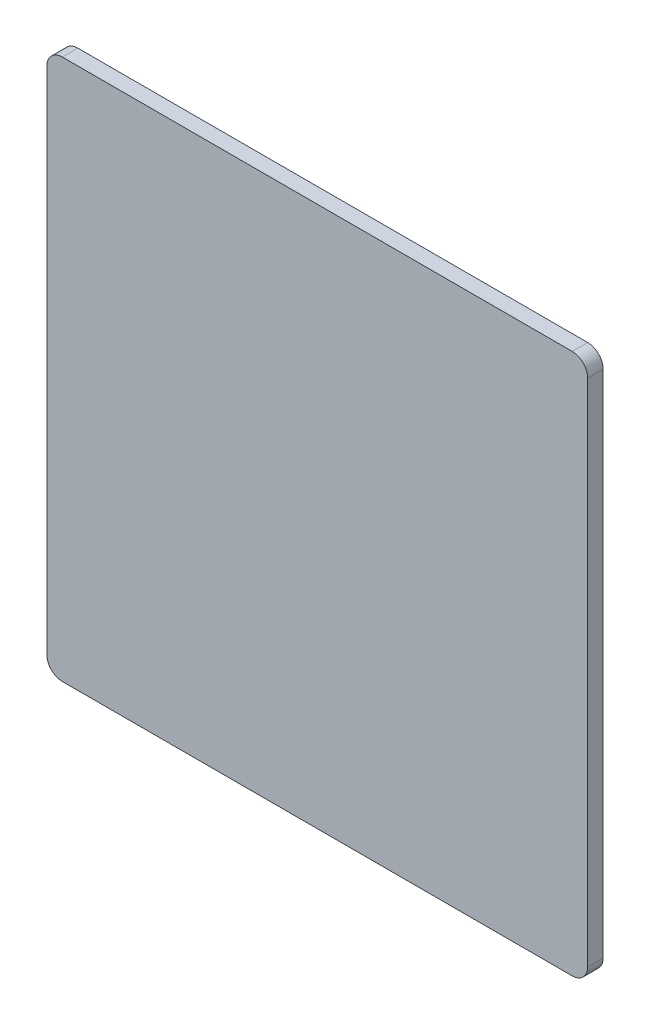
ISO-10303-21;
HEADER;
FILE_DESCRIPTION(('STEP AP214'),'2;1');
FILE_NAME('part.step','',(''),(''),'','','');
FILE_SCHEMA(('AUTOMOTIVE_DESIGN { 1 0 10303 214 1 1 1 1 }'));
ENDSEC;
DATA;
#1=APPLICATION_CONTEXT('core data for automotive mechanical design processes');
#2=APPLICATION_PROTOCOL_DEFINITION('international standard','automotive_design',2000,#1);
#3=PRODUCT_CONTEXT('',#1,'mechanical');
#4=PRODUCT('Part','Part','',(#3));
#5=PRODUCT_RELATED_PRODUCT_CATEGORY('part','',(#4));
#6=PRODUCT_DEFINITION_FORMATION('','',#4);
#7=PRODUCT_DEFINITION_CONTEXT('part definition',#1,'design');
#8=PRODUCT_DEFINITION('design','',#6,#7);
#9=PRODUCT_DEFINITION_SHAPE('','',#8);
#10=(LENGTH_UNIT() NAMED_UNIT(*) SI_UNIT(.MILLI.,.METRE.));
#11=(NAMED_UNIT(*) PLANE_ANGLE_UNIT() SI_UNIT($,.RADIAN.));
#12=(NAMED_UNIT(*) SI_UNIT($,.STERADIAN.) SOLID_ANGLE_UNIT());
#13=UNCERTAINTY_MEASURE_WITH_UNIT(LENGTH_MEASURE(1.E-05),#10,'distance_accuracy_value','');
#14=(GEOMETRIC_REPRESENTATION_CONTEXT(3) GLOBAL_UNCERTAINTY_ASSIGNED_CONTEXT((#13)) GLOBAL_UNIT_ASSIGNED_CONTEXT((#10,
#11,#12)) REPRESENTATION_CONTEXT('',''));
#15=CARTESIAN_POINT('',(0.,0.,0.));
#16=DIRECTION('',(0.,0.,1.));
#17=DIRECTION('',(1.,0.,0.));
#18=AXIS2_PLACEMENT_3D('',#15,#16,#17);
#19=CARTESIAN_POINT('',(35.,-35.,2.));
#20=DIRECTION('',(-1.,0.,0.));
#21=DIRECTION('',(0.,0.,1.));
#22=AXIS2_PLACEMENT_3D('',#19,#20,#21);
#23=PLANE('',#22);
#24=DIRECTION('',(0.,1.,0.));
#25=VECTOR('',#24,1.);
#26=CARTESIAN_POINT('',(35.,-35.,2.));
#27=LINE('',#26,#25);
#28=CARTESIAN_POINT('',(35.,-33.,2.));
#29=VERTEX_POINT('',#28);
#30=CARTESIAN_POINT('',(35.,33.,2.));
#31=VERTEX_POINT('',#30);
#32=EDGE_CURVE('E199',#29,#31,#27,.T.);
#33=ORIENTED_EDGE('',*,*,#32,.F.);
#34=DIRECTION('',(0.,0.,-1.));
#35=VECTOR('',#34,1.);
#36=CARTESIAN_POINT('',(35.,-33.,2.));
#37=LINE('',#36,#35);
#38=CARTESIAN_POINT('',(35.,-33.,0.));
#39=VERTEX_POINT('',#38);
#40=EDGE_CURVE('E239',#29,#39,#37,.T.);
#41=ORIENTED_EDGE('',*,*,#40,.T.);
#42=DIRECTION('',(0.,1.,0.));
#43=VECTOR('',#42,1.);
#44=CARTESIAN_POINT('',(35.,-35.,0.));
#45=LINE('',#44,#43);
#46=CARTESIAN_POINT('',(35.,33.,0.));
#47=VERTEX_POINT('',#46);
#48=EDGE_CURVE('E196',#39,#47,#45,.T.);
#49=ORIENTED_EDGE('',*,*,#48,.T.);
#50=DIRECTION('',(0.,0.,-1.));
#51=VECTOR('',#50,1.);
#52=CARTESIAN_POINT('',(35.,33.,2.));
#53=LINE('',#52,#51);
#54=EDGE_CURVE('E226',#47,#31,#53,.F.);
#55=ORIENTED_EDGE('',*,*,#54,.T.);
#56=EDGE_LOOP('',(#33,#41,#49,#55));
#57=FACE_BOUND('',#56,.T.);
#58=ADVANCED_FACE('F33',(#57),#23,.F.);
#59=CARTESIAN_POINT('',(-35.,35.,2.));
#60=DIRECTION('',(0.,-1.,0.));
#61=DIRECTION('',(0.,0.,-1.));
#62=AXIS2_PLACEMENT_3D('',#59,#60,#61);
#63=PLANE('',#62);
#64=DIRECTION('',(-1.,0.,0.));
#65=VECTOR('',#64,1.);
#66=CARTESIAN_POINT('',(-35.,35.,0.));
#67=LINE('',#66,#65);
#68=CARTESIAN_POINT('',(33.,35.,0.));
#69=VERTEX_POINT('',#68);
#70=CARTESIAN_POINT('',(-33.,35.,0.));
#71=VERTEX_POINT('',#70);
#72=EDGE_CURVE('E213',#69,#71,#67,.T.);
#73=ORIENTED_EDGE('',*,*,#72,.T.);
#74=DIRECTION('',(0.,0.,-1.));
#75=VECTOR('',#74,1.);
#76=CARTESIAN_POINT('',(-33.,35.,2.));
#77=LINE('',#76,#75);
#78=CARTESIAN_POINT('',(-33.,35.,2.));
#79=VERTEX_POINT('',#78);
#80=EDGE_CURVE('E11',#71,#79,#77,.F.);
#81=ORIENTED_EDGE('',*,*,#80,.T.);
#82=DIRECTION('',(-1.,0.,0.));
#83=VECTOR('',#82,1.);
#84=CARTESIAN_POINT('',(-35.,35.,2.));
#85=LINE('',#84,#83);
#86=CARTESIAN_POINT('',(33.,35.,2.));
#87=VERTEX_POINT('',#86);
#88=EDGE_CURVE('E202',#87,#79,#85,.T.);
#89=ORIENTED_EDGE('',*,*,#88,.F.);
#90=DIRECTION('',(0.,0.,-1.));
#91=VECTOR('',#90,1.);
#92=CARTESIAN_POINT('',(33.,35.,2.));
#93=LINE('',#92,#91);
#94=EDGE_CURVE('E41',#87,#69,#93,.T.);
#95=ORIENTED_EDGE('',*,*,#94,.T.);
#96=EDGE_LOOP('',(#73,#81,#89,#95));
#97=FACE_BOUND('',#96,.T.);
#98=ADVANCED_FACE('F270',(#97),#63,.F.);
#99=CARTESIAN_POINT('',(-35.,-35.,2.));
#100=DIRECTION('',(1.,0.,0.));
#101=DIRECTION('',(0.,0.,-1.));
#102=AXIS2_PLACEMENT_3D('',#99,#100,#101);
#103=PLANE('',#102);
#104=DIRECTION('',(0.,-1.,0.));
#105=VECTOR('',#104,1.);
#106=CARTESIAN_POINT('',(-35.,-35.,0.));
#107=LINE('',#106,#105);
#108=CARTESIAN_POINT('',(-35.,33.,0.));
#109=VERTEX_POINT('',#108);
#110=CARTESIAN_POINT('',(-35.,-33.,0.));
#111=VERTEX_POINT('',#110);
#112=EDGE_CURVE('E216',#109,#111,#107,.T.);
#113=ORIENTED_EDGE('',*,*,#112,.T.);
#114=DIRECTION('',(0.,0.,-1.));
#115=VECTOR('',#114,1.);
#116=CARTESIAN_POINT('',(-35.,-33.,2.));
#117=LINE('',#116,#115);
#118=CARTESIAN_POINT('',(-35.,-33.,2.));
#119=VERTEX_POINT('',#118);
#120=EDGE_CURVE('E48',#111,#119,#117,.F.);
#121=ORIENTED_EDGE('',*,*,#120,.T.);
#122=DIRECTION('',(0.,-1.,0.));
#123=VECTOR('',#122,1.);
#124=CARTESIAN_POINT('',(-35.,-35.,2.));
#125=LINE('',#124,#123);
#126=CARTESIAN_POINT('',(-35.,33.,2.));
#127=VERTEX_POINT('',#126);
#128=EDGE_CURVE('E205',#127,#119,#125,.T.);
#129=ORIENTED_EDGE('',*,*,#128,.F.);
#130=DIRECTION('',(0.,0.,-1.));
#131=VECTOR('',#130,1.);
#132=CARTESIAN_POINT('',(-35.,33.,2.));
#133=LINE('',#132,#131);
#134=EDGE_CURVE('E262',#127,#109,#133,.T.);
#135=ORIENTED_EDGE('',*,*,#134,.T.);
#136=EDGE_LOOP('',(#113,#121,#129,#135));
#137=FACE_BOUND('',#136,.T.);
#138=ADVANCED_FACE('F281',(#137),#103,.F.);
#139=CARTESIAN_POINT('',(-35.,-35.,2.));
#140=DIRECTION('',(0.,1.,0.));
#141=DIRECTION('',(0.,0.,1.));
#142=AXIS2_PLACEMENT_3D('',#139,#140,#141);
#143=PLANE('',#142);
#144=DIRECTION('',(1.,0.,0.));
#145=VECTOR('',#144,1.);
#146=CARTESIAN_POINT('',(-35.,-35.,0.));
#147=LINE('',#146,#145);
#148=CARTESIAN_POINT('',(7.2,-35.,0.));
#149=VERTEX_POINT('',#148);
#150=CARTESIAN_POINT('',(33.,-35.,0.));
#151=VERTEX_POINT('',#150);
#152=EDGE_CURVE('E218',#149,#151,#147,.T.);
#153=ORIENTED_EDGE('',*,*,#152,.T.);
#154=DIRECTION('',(0.,0.,-1.));
#155=VECTOR('',#154,1.);
#156=CARTESIAN_POINT('',(33.,-35.,2.));
#157=LINE('',#156,#155);
#158=CARTESIAN_POINT('',(33.,-35.,2.));
#159=VERTEX_POINT('',#158);
#160=EDGE_CURVE('E253',#151,#159,#157,.F.);
#161=ORIENTED_EDGE('',*,*,#160,.T.);
#162=DIRECTION('',(1.,0.,0.));
#163=VECTOR('',#162,1.);
#164=CARTESIAN_POINT('',(-35.,-35.,2.));
#165=LINE('',#164,#163);
#166=CARTESIAN_POINT('',(-33.,-35.,2.));
#167=VERTEX_POINT('',#166);
#168=EDGE_CURVE('E207',#167,#159,#165,.T.);
#169=ORIENTED_EDGE('',*,*,#168,.F.);
#170=DIRECTION('',(0.,0.,-1.));
#171=VECTOR('',#170,1.);
#172=CARTESIAN_POINT('',(-33.,-35.,2.));
#173=LINE('',#172,#171);
#174=CARTESIAN_POINT('',(-33.,-35.,0.));
#175=VERTEX_POINT('',#174);
#176=EDGE_CURVE('E250',#167,#175,#173,.T.);
#177=ORIENTED_EDGE('',*,*,#176,.T.);
#178=CARTESIAN_POINT('',(-7.2,-35.,0.));
#179=VERTEX_POINT('',#178);
#180=EDGE_CURVE('E203',#175,#179,#147,.T.);
#181=ORIENTED_EDGE('',*,*,#180,.T.);
#182=DIRECTION('',(0.,0.,-1.));
#183=VECTOR('',#182,1.);
#184=CARTESIAN_POINT('',(-7.2,-35.,1.9));
#185=LINE('',#184,#183);
#186=CARTESIAN_POINT('',(-7.2,-35.,-6.5));
#187=VERTEX_POINT('',#186);
#188=EDGE_CURVE('E189',#179,#187,#185,.T.);
#189=ORIENTED_EDGE('',*,*,#188,.T.);
#190=DIRECTION('',(1.,0.,0.));
#191=VECTOR('',#190,1.);
#192=CARTESIAN_POINT('',(7.2,-35.,-6.5));
#193=LINE('',#192,#191);
#194=CARTESIAN_POINT('',(7.2,-35.,-6.5));
#195=VERTEX_POINT('',#194);
#196=EDGE_CURVE('E181',#187,#195,#193,.T.);
#197=ORIENTED_EDGE('',*,*,#196,.T.);
#198=DIRECTION('',(0.,0.,1.));
#199=VECTOR('',#198,1.);
#200=CARTESIAN_POINT('',(7.2,-35.,1.9));
#201=LINE('',#200,#199);
#202=EDGE_CURVE('E187',#195,#149,#201,.T.);
#203=ORIENTED_EDGE('',*,*,#202,.T.);
#204=EDGE_LOOP('',(#153,#161,#169,#177,#181,#189,#197,#203));
#205=FACE_BOUND('',#204,.T.);
#206=DIRECTION('',(1.,0.,0.));
#207=VECTOR('',#206,1.);
#208=CARTESIAN_POINT('',(5.2,-35.,-4.5));
#209=LINE('',#208,#207);
#210=CARTESIAN_POINT('',(-5.2,-35.,-4.5));
#211=VERTEX_POINT('',#210);
#212=CARTESIAN_POINT('',(5.2,-35.,-4.5));
#213=VERTEX_POINT('',#212);
#214=EDGE_CURVE('E163',#211,#213,#209,.T.);
#215=ORIENTED_EDGE('',*,*,#214,.F.);
#216=DIRECTION('',(0.,0.,-1.));
#217=VECTOR('',#216,1.);
#218=CARTESIAN_POINT('',(-5.2,-35.,-0.1));
#219=LINE('',#218,#217);
#220=CARTESIAN_POINT('',(-5.2,-35.,-0.1));
#221=VERTEX_POINT('',#220);
#222=EDGE_CURVE('E167',#221,#211,#219,.T.);
#223=ORIENTED_EDGE('',*,*,#222,.F.);
#224=DIRECTION('',(-1.,0.,0.));
#225=VECTOR('',#224,1.);
#226=CARTESIAN_POINT('',(5.2,-35.,-0.1));
#227=LINE('',#226,#225);
#228=CARTESIAN_POINT('',(5.2,-35.,-0.1));
#229=VERTEX_POINT('',#228);
#230=EDGE_CURVE('E171',#229,#221,#227,.T.);
#231=ORIENTED_EDGE('',*,*,#230,.F.);
#232=DIRECTION('',(0.,0.,1.));
#233=VECTOR('',#232,1.);
#234=CARTESIAN_POINT('',(5.2,-35.,-0.1));
#235=LINE('',#234,#233);
#236=EDGE_CURVE('E151',#213,#229,#235,.T.);
#237=ORIENTED_EDGE('',*,*,#236,.F.);
#238=EDGE_LOOP('',(#215,#223,#231,#237));
#239=FACE_BOUND('',#238,.T.);
#240=ADVANCED_FACE('F169',(#205,#239),#143,.F.);
#241=CARTESIAN_POINT('',(0.,0.,2.));
#242=DIRECTION('',(0.,0.,-1.));
#243=DIRECTION('',(-1.,0.,0.));
#244=AXIS2_PLACEMENT_3D('',#241,#242,#243);
#245=PLANE('',#244);
#246=ORIENTED_EDGE('',*,*,#168,.T.);
#247=CARTESIAN_POINT('',(33.,-33.,2.));
#248=DIRECTION('',(0.,0.,-1.));
#249=DIRECTION('',(-1.,0.,0.));
#250=AXIS2_PLACEMENT_3D('',#247,#248,#249);
#251=CIRCLE('',#250,2.);
#252=EDGE_CURVE('E260',#159,#29,#251,.F.);
#253=ORIENTED_EDGE('',*,*,#252,.T.);
#254=ORIENTED_EDGE('',*,*,#32,.T.);
#255=CARTESIAN_POINT('',(33.,33.,2.));
#256=DIRECTION('',(0.,0.,-1.));
#257=DIRECTION('',(-1.,0.,0.));
#258=AXIS2_PLACEMENT_3D('',#255,#256,#257);
#259=CIRCLE('',#258,2.);
#260=EDGE_CURVE('E255',#31,#87,#259,.F.);
#261=ORIENTED_EDGE('',*,*,#260,.T.);
#262=ORIENTED_EDGE('',*,*,#88,.T.);
#263=CARTESIAN_POINT('',(-33.,33.,2.));
#264=DIRECTION('',(0.,0.,-1.));
#265=DIRECTION('',(-1.,0.,0.));
#266=AXIS2_PLACEMENT_3D('',#263,#264,#265);
#267=CIRCLE('',#266,2.);
#268=EDGE_CURVE('E55',#79,#127,#267,.F.);
#269=ORIENTED_EDGE('',*,*,#268,.T.);
#270=ORIENTED_EDGE('',*,*,#128,.T.);
#271=CARTESIAN_POINT('',(-33.,-33.,2.));
#272=DIRECTION('',(0.,0.,-1.));
#273=DIRECTION('',(-1.,0.,0.));
#274=AXIS2_PLACEMENT_3D('',#271,#272,#273);
#275=CIRCLE('',#274,2.);
#276=EDGE_CURVE('E258',#119,#167,#275,.F.);
#277=ORIENTED_EDGE('',*,*,#276,.T.);
#278=EDGE_LOOP('',(#246,#253,#254,#261,#262,#269,#270,#277));
#279=FACE_BOUND('',#278,.T.);
#280=ADVANCED_FACE('F283',(#279),#245,.F.);
#281=CARTESIAN_POINT('',(0.,0.,0.));
#282=DIRECTION('',(0.,0.,-1.));
#283=DIRECTION('',(-1.,0.,0.));
#284=AXIS2_PLACEMENT_3D('',#281,#282,#283);
#285=PLANE('',#284);
#286=ORIENTED_EDGE('',*,*,#48,.F.);
#287=CARTESIAN_POINT('',(33.,-33.,0.));
#288=DIRECTION('',(0.,0.,-1.));
#289=DIRECTION('',(-1.,0.,0.));
#290=AXIS2_PLACEMENT_3D('',#287,#288,#289);
#291=CIRCLE('',#290,2.);
#292=EDGE_CURVE('E248',#39,#151,#291,.T.);
#293=ORIENTED_EDGE('',*,*,#292,.T.);
#294=ORIENTED_EDGE('',*,*,#152,.F.);
#295=DIRECTION('',(0.,-1.,0.));
#296=VECTOR('',#295,1.);
#297=CARTESIAN_POINT('',(7.2,0.,0.));
#298=LINE('',#297,#296);
#299=CARTESIAN_POINT('',(7.2,-20.,0.));
#300=VERTEX_POINT('',#299);
#301=EDGE_CURVE('E223',#300,#149,#298,.T.);
#302=ORIENTED_EDGE('',*,*,#301,.F.);
#303=DIRECTION('',(1.,0.,0.));
#304=VECTOR('',#303,1.);
#305=CARTESIAN_POINT('',(0.,-20.,0.));
#306=LINE('',#305,#304);
#307=CARTESIAN_POINT('',(-7.2,-20.,0.));
#308=VERTEX_POINT('',#307);
#309=EDGE_CURVE('E210',#308,#300,#306,.T.);
#310=ORIENTED_EDGE('',*,*,#309,.F.);
#311=DIRECTION('',(0.,1.,0.));
#312=VECTOR('',#311,1.);
#313=CARTESIAN_POINT('',(-7.2,0.,0.));
#314=LINE('',#313,#312);
#315=EDGE_CURVE('E221',#179,#308,#314,.T.);
#316=ORIENTED_EDGE('',*,*,#315,.F.);
#317=ORIENTED_EDGE('',*,*,#180,.F.);
#318=CARTESIAN_POINT('',(-33.,-33.,0.));
#319=DIRECTION('',(0.,0.,-1.));
#320=DIRECTION('',(-1.,0.,0.));
#321=AXIS2_PLACEMENT_3D('',#318,#319,#320);
#322=CIRCLE('',#321,2.);
#323=EDGE_CURVE('E246',#175,#111,#322,.T.);
#324=ORIENTED_EDGE('',*,*,#323,.T.);
#325=ORIENTED_EDGE('',*,*,#112,.F.);
#326=CARTESIAN_POINT('',(-33.,33.,0.));
#327=DIRECTION('',(0.,0.,-1.));
#328=DIRECTION('',(-1.,0.,0.));
#329=AXIS2_PLACEMENT_3D('',#326,#327,#328);
#330=CIRCLE('',#329,2.);
#331=EDGE_CURVE('E244',#109,#71,#330,.T.);
#332=ORIENTED_EDGE('',*,*,#331,.T.);
#333=ORIENTED_EDGE('',*,*,#72,.F.);
#334=CARTESIAN_POINT('',(33.,33.,0.));
#335=DIRECTION('',(0.,0.,-1.));
#336=DIRECTION('',(-1.,0.,0.));
#337=AXIS2_PLACEMENT_3D('',#334,#335,#336);
#338=CIRCLE('',#337,2.);
#339=EDGE_CURVE('E242',#69,#47,#338,.T.);
#340=ORIENTED_EDGE('',*,*,#339,.T.);
#341=EDGE_LOOP('',(#286,#293,#294,#302,#310,#316,#317,#324,#325,#332,#333,#340));
#342=FACE_BOUND('',#341,.T.);
#343=ADVANCED_FACE('F276',(#342),#285,.T.);
#344=CARTESIAN_POINT('',(7.2,-20.,1.9));
#345=DIRECTION('',(1.,0.,0.));
#346=DIRECTION('',(0.,0.,-1.));
#347=AXIS2_PLACEMENT_3D('',#344,#345,#346);
#348=PLANE('',#347);
#349=DIRECTION('',(0.,0.,1.));
#350=VECTOR('',#349,1.);
#351=CARTESIAN_POINT('',(7.2,-20.,1.9));
#352=LINE('',#351,#350);
#353=CARTESIAN_POINT('',(7.2,-20.,-6.5));
#354=VERTEX_POINT('',#353);
#355=EDGE_CURVE('E177',#354,#300,#352,.T.);
#356=ORIENTED_EDGE('',*,*,#355,.T.);
#357=ORIENTED_EDGE('',*,*,#301,.T.);
#358=ORIENTED_EDGE('',*,*,#202,.F.);
#359=DIRECTION('',(0.,-1.,0.));
#360=VECTOR('',#359,1.);
#361=CARTESIAN_POINT('',(7.2,-20.,-6.5));
#362=LINE('',#361,#360);
#363=EDGE_CURVE('E194',#354,#195,#362,.T.);
#364=ORIENTED_EDGE('',*,*,#363,.F.);
#365=EDGE_LOOP('',(#356,#357,#358,#364));
#366=FACE_BOUND('',#365,.T.);
#367=ADVANCED_FACE('F310',(#366),#348,.T.);
#368=CARTESIAN_POINT('',(7.2,-20.,-6.5));
#369=DIRECTION('',(0.,0.,-1.));
#370=DIRECTION('',(-1.,0.,0.));
#371=AXIS2_PLACEMENT_3D('',#368,#369,#370);
#372=PLANE('',#371);
#373=ORIENTED_EDGE('',*,*,#196,.F.);
#374=DIRECTION('',(0.,-1.,0.));
#375=VECTOR('',#374,1.);
#376=CARTESIAN_POINT('',(-7.2,-20.,-6.5));
#377=LINE('',#376,#375);
#378=CARTESIAN_POINT('',(-7.2,-20.,-6.5));
#379=VERTEX_POINT('',#378);
#380=EDGE_CURVE('E186',#379,#187,#377,.T.);
#381=ORIENTED_EDGE('',*,*,#380,.F.);
#382=DIRECTION('',(1.,0.,0.));
#383=VECTOR('',#382,1.);
#384=CARTESIAN_POINT('',(7.2,-20.,-6.5));
#385=LINE('',#384,#383);
#386=EDGE_CURVE('E183',#379,#354,#385,.T.);
#387=ORIENTED_EDGE('',*,*,#386,.T.);
#388=ORIENTED_EDGE('',*,*,#363,.T.);
#389=EDGE_LOOP('',(#373,#381,#387,#388));
#390=FACE_BOUND('',#389,.T.);
#391=ADVANCED_FACE('F305',(#390),#372,.T.);
#392=CARTESIAN_POINT('',(-7.2,-20.,1.9));
#393=DIRECTION('',(-1.,0.,0.));
#394=DIRECTION('',(0.,0.,1.));
#395=AXIS2_PLACEMENT_3D('',#392,#393,#394);
#396=PLANE('',#395);
#397=ORIENTED_EDGE('',*,*,#188,.F.);
#398=ORIENTED_EDGE('',*,*,#315,.T.);
#399=DIRECTION('',(0.,0.,-1.));
#400=VECTOR('',#399,1.);
#401=CARTESIAN_POINT('',(-7.2,-20.,1.9));
#402=LINE('',#401,#400);
#403=EDGE_CURVE('E180',#308,#379,#402,.T.);
#404=ORIENTED_EDGE('',*,*,#403,.T.);
#405=ORIENTED_EDGE('',*,*,#380,.T.);
#406=EDGE_LOOP('',(#397,#398,#404,#405));
#407=FACE_BOUND('',#406,.T.);
#408=ADVANCED_FACE('F297',(#407),#396,.T.);
#409=CARTESIAN_POINT('',(0.,-20.,0.));
#410=DIRECTION('',(0.,1.,0.));
#411=DIRECTION('',(0.,0.,1.));
#412=AXIS2_PLACEMENT_3D('',#409,#410,#411);
#413=PLANE('',#412);
#414=DIRECTION('',(0.,0.,1.));
#415=VECTOR('',#414,1.);
#416=CARTESIAN_POINT('',(-4.67618845762378,-20.,-0.1));
#417=LINE('',#416,#415);
#418=CARTESIAN_POINT('',(-4.67618845762378,-20.,-0.623811542376217));
#419=VERTEX_POINT('',#418);
#420=CARTESIAN_POINT('',(-4.67618845762378,-20.,-3.97618845762378));
#421=VERTEX_POINT('',#420);
#422=EDGE_CURVE('E173',#419,#421,#417,.F.);
#423=ORIENTED_EDGE('',*,*,#422,.T.);
#424=DIRECTION('',(-1.,0.,0.));
#425=VECTOR('',#424,1.);
#426=CARTESIAN_POINT('',(5.2,-20.,-3.97618845762378));
#427=LINE('',#426,#425);
#428=CARTESIAN_POINT('',(4.67618845762378,-20.,-3.97618845762378));
#429=VERTEX_POINT('',#428);
#430=EDGE_CURVE('E235',#421,#429,#427,.F.);
#431=ORIENTED_EDGE('',*,*,#430,.T.);
#432=DIRECTION('',(0.,0.,-1.));
#433=VECTOR('',#432,1.);
#434=CARTESIAN_POINT('',(4.67618845762378,-20.,-0.1));
#435=LINE('',#434,#433);
#436=CARTESIAN_POINT('',(4.67618845762378,-20.,-0.623811542376217));
#437=VERTEX_POINT('',#436);
#438=EDGE_CURVE('E154',#429,#437,#435,.F.);
#439=ORIENTED_EDGE('',*,*,#438,.T.);
#440=DIRECTION('',(1.,0.,0.));
#441=VECTOR('',#440,1.);
#442=CARTESIAN_POINT('',(5.2,-20.,-0.623811542376217));
#443=LINE('',#442,#441);
#444=EDGE_CURVE('E229',#437,#419,#443,.F.);
#445=ORIENTED_EDGE('',*,*,#444,.T.);
#446=EDGE_LOOP('',(#423,#431,#439,#445));
#447=FACE_BOUND('',#446,.T.);
#448=ORIENTED_EDGE('',*,*,#403,.F.);
#449=ORIENTED_EDGE('',*,*,#309,.T.);
#450=ORIENTED_EDGE('',*,*,#355,.F.);
#451=ORIENTED_EDGE('',*,*,#386,.F.);
#452=EDGE_LOOP('',(#448,#449,#450,#451));
#453=FACE_BOUND('',#452,.T.);
#454=ADVANCED_FACE('F301',(#447,#453),#413,.T.);
#455=CARTESIAN_POINT('',(-5.2,-35.,-0.1));
#456=DIRECTION('',(0.999390827019096,-0.034899496702501,0.));
#457=DIRECTION('',(0.034899496702501,0.999390827019096,0.));
#458=AXIS2_PLACEMENT_3D('',#455,#456,#457);
#459=PLANE('',#458);
#460=ORIENTED_EDGE('',*,*,#222,.T.);
#461=DIRECTION('',(-0.0348782627423747,-0.998782765958718,-0.0348782627423747));
#462=VECTOR('',#461,1.);
#463=CARTESIAN_POINT('',(-5.19464742986752,-34.8467224459719,-4.49464742986752));
#464=LINE('',#463,#462);
#465=EDGE_CURVE('E159',#421,#211,#464,.T.);
#466=ORIENTED_EDGE('',*,*,#465,.F.);
#467=ORIENTED_EDGE('',*,*,#422,.F.);
#468=DIRECTION('',(-0.0348782627423747,-0.998782765958718,0.0348782627423747));
#469=VECTOR('',#468,1.);
#470=CARTESIAN_POINT('',(-5.18734847059597,-34.6377075995699,-0.112651529404032));
#471=LINE('',#470,#469);
#472=EDGE_CURVE('E190',#419,#221,#471,.T.);
#473=ORIENTED_EDGE('',*,*,#472,.T.);
#474=EDGE_LOOP('',(#460,#466,#467,#473));
#475=FACE_BOUND('',#474,.T.);
#476=ADVANCED_FACE('F333',(#475),#459,.T.);
#477=CARTESIAN_POINT('',(5.2,-35.,-0.1));
#478=DIRECTION('',(0.,-0.034899496702501,-0.999390827019096));
#479=DIRECTION('',(0.,0.999390827019096,-0.034899496702501));
#480=AXIS2_PLACEMENT_3D('',#477,#478,#479);
#481=PLANE('',#480);
#482=ORIENTED_EDGE('',*,*,#230,.T.);
#483=ORIENTED_EDGE('',*,*,#472,.F.);
#484=ORIENTED_EDGE('',*,*,#444,.F.);
#485=DIRECTION('',(0.0348782627423747,-0.998782765958718,0.0348782627423747));
#486=VECTOR('',#485,1.);
#487=CARTESIAN_POINT('',(5.2,-35.,-0.1));
#488=LINE('',#487,#486);
#489=EDGE_CURVE('E158',#437,#229,#488,.T.);
#490=ORIENTED_EDGE('',*,*,#489,.T.);
#491=EDGE_LOOP('',(#482,#483,#484,#490));
#492=FACE_BOUND('',#491,.T.);
#493=ADVANCED_FACE('F330',(#492),#481,.T.);
#494=CARTESIAN_POINT('',(5.2,-35.,-0.1));
#495=DIRECTION('',(-0.999390827019096,-0.034899496702501,0.));
#496=DIRECTION('',(0.034899496702501,-0.999390827019096,0.));
#497=AXIS2_PLACEMENT_3D('',#494,#495,#496);
#498=PLANE('',#497);
#499=ORIENTED_EDGE('',*,*,#236,.T.);
#500=ORIENTED_EDGE('',*,*,#489,.F.);
#501=ORIENTED_EDGE('',*,*,#438,.F.);
#502=DIRECTION('',(0.0348782627423747,-0.998782765958718,-0.0348782627423747));
#503=VECTOR('',#502,1.);
#504=CARTESIAN_POINT('',(5.2,-35.,-4.5));
#505=LINE('',#504,#503);
#506=EDGE_CURVE('E147',#429,#213,#505,.T.);
#507=ORIENTED_EDGE('',*,*,#506,.T.);
#508=EDGE_LOOP('',(#499,#500,#501,#507));
#509=FACE_BOUND('',#508,.T.);
#510=ADVANCED_FACE('F149',(#509),#498,.T.);
#511=CARTESIAN_POINT('',(5.2,-35.,-4.5));
#512=DIRECTION('',(0.,-0.034899496702501,0.999390827019096));
#513=DIRECTION('',(0.,-0.999390827019096,-0.034899496702501));
#514=AXIS2_PLACEMENT_3D('',#511,#512,#513);
#515=PLANE('',#514);
#516=ORIENTED_EDGE('',*,*,#214,.T.);
#517=ORIENTED_EDGE('',*,*,#506,.F.);
#518=ORIENTED_EDGE('',*,*,#430,.F.);
#519=ORIENTED_EDGE('',*,*,#465,.T.);
#520=EDGE_LOOP('',(#516,#517,#518,#519));
#521=FACE_BOUND('',#520,.T.);
#522=ADVANCED_FACE('F164',(#521),#515,.T.);
#523=CARTESIAN_POINT('',(33.,-33.,2.));
#524=DIRECTION('',(0.,0.,-1.));
#525=DIRECTION('',(-1.,0.,0.));
#526=AXIS2_PLACEMENT_3D('',#523,#524,#525);
#527=CYLINDRICAL_SURFACE('',#526,2.);
#528=ORIENTED_EDGE('',*,*,#252,.F.);
#529=ORIENTED_EDGE('',*,*,#160,.F.);
#530=ORIENTED_EDGE('',*,*,#292,.F.);
#531=ORIENTED_EDGE('',*,*,#40,.F.);
#532=EDGE_LOOP('',(#528,#529,#530,#531));
#533=FACE_BOUND('',#532,.T.);
#534=ADVANCED_FACE('F314',(#533),#527,.T.);
#535=CARTESIAN_POINT('',(-33.,-33.,2.));
#536=DIRECTION('',(0.,0.,-1.));
#537=DIRECTION('',(-1.,0.,0.));
#538=AXIS2_PLACEMENT_3D('',#535,#536,#537);
#539=CYLINDRICAL_SURFACE('',#538,2.);
#540=ORIENTED_EDGE('',*,*,#276,.F.);
#541=ORIENTED_EDGE('',*,*,#120,.F.);
#542=ORIENTED_EDGE('',*,*,#323,.F.);
#543=ORIENTED_EDGE('',*,*,#176,.F.);
#544=EDGE_LOOP('',(#540,#541,#542,#543));
#545=FACE_BOUND('',#544,.T.);
#546=ADVANCED_FACE('F287',(#545),#539,.T.);
#547=CARTESIAN_POINT('',(-33.,33.,2.));
#548=DIRECTION('',(0.,0.,-1.));
#549=DIRECTION('',(-1.,0.,0.));
#550=AXIS2_PLACEMENT_3D('',#547,#548,#549);
#551=CYLINDRICAL_SURFACE('',#550,2.);
#552=ORIENTED_EDGE('',*,*,#268,.F.);
#553=ORIENTED_EDGE('',*,*,#80,.F.);
#554=ORIENTED_EDGE('',*,*,#331,.F.);
#555=ORIENTED_EDGE('',*,*,#134,.F.);
#556=EDGE_LOOP('',(#552,#553,#554,#555));
#557=FACE_BOUND('',#556,.T.);
#558=ADVANCED_FACE('F280',(#557),#551,.T.);
#559=CARTESIAN_POINT('',(33.,33.,2.));
#560=DIRECTION('',(0.,0.,-1.));
#561=DIRECTION('',(-1.,0.,0.));
#562=AXIS2_PLACEMENT_3D('',#559,#560,#561);
#563=CYLINDRICAL_SURFACE('',#562,2.);
#564=ORIENTED_EDGE('',*,*,#260,.F.);
#565=ORIENTED_EDGE('',*,*,#54,.F.);
#566=ORIENTED_EDGE('',*,*,#339,.F.);
#567=ORIENTED_EDGE('',*,*,#94,.F.);
#568=EDGE_LOOP('',(#564,#565,#566,#567));
#569=FACE_BOUND('',#568,.T.);
#570=ADVANCED_FACE('F35',(#569),#563,.T.);
#571=CLOSED_SHELL('',(#58,#98,#138,#240,#280,#343,#367,#391,#408,#454,#476,#493,#510,#522,#534,
#546,#558,#570));
#572=MANIFOLD_SOLID_BREP('B2',#571);
#573=ADVANCED_BREP_SHAPE_REPRESENTATION('',(#18,#572),#14);
#574=SHAPE_DEFINITION_REPRESENTATION(#9,#573);
ENDSEC;
END-ISO-10303-21;
